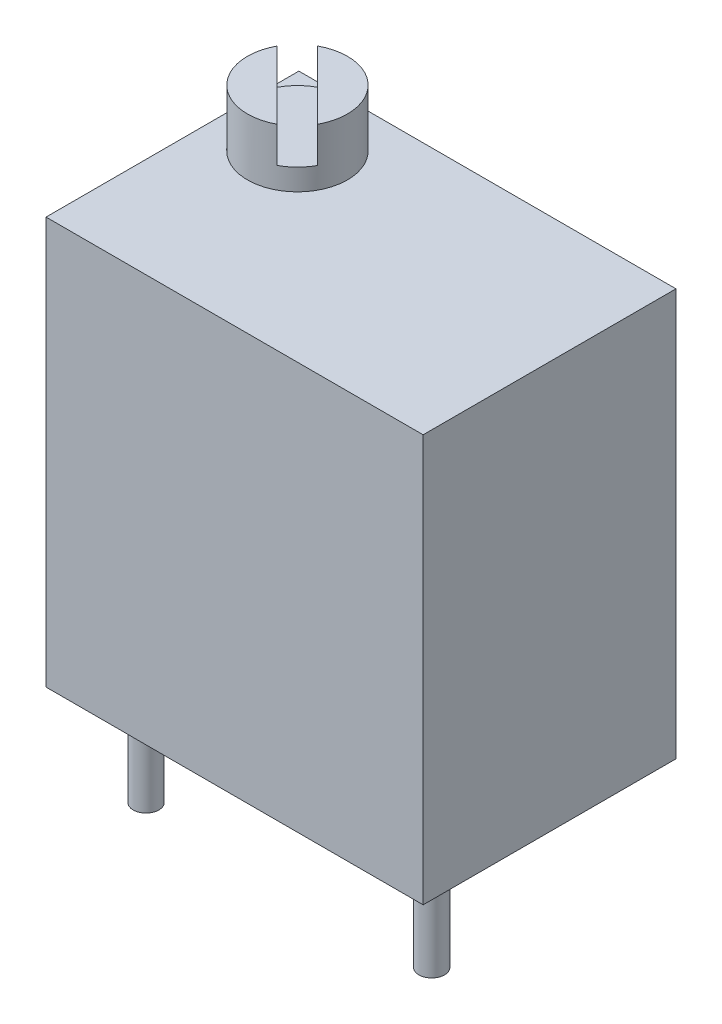
ISO-10303-21;
HEADER;
FILE_DESCRIPTION(('STEP AP214'),'2;1');
FILE_NAME('part.step','',(''),(''),'','','');
FILE_SCHEMA(('AUTOMOTIVE_DESIGN { 1 0 10303 214 1 1 1 1 }'));
ENDSEC;
DATA;
#1=APPLICATION_CONTEXT('core data for automotive mechanical design processes');
#2=APPLICATION_PROTOCOL_DEFINITION('international standard','automotive_design',2000,#1);
#3=PRODUCT_CONTEXT('',#1,'mechanical');
#4=PRODUCT('Part','Part','',(#3));
#5=PRODUCT_RELATED_PRODUCT_CATEGORY('part','',(#4));
#6=PRODUCT_DEFINITION_FORMATION('','',#4);
#7=PRODUCT_DEFINITION_CONTEXT('part definition',#1,'design');
#8=PRODUCT_DEFINITION('design','',#6,#7);
#9=PRODUCT_DEFINITION_SHAPE('','',#8);
#10=(LENGTH_UNIT() NAMED_UNIT(*) SI_UNIT(.MILLI.,.METRE.));
#11=(NAMED_UNIT(*) PLANE_ANGLE_UNIT() SI_UNIT($,.RADIAN.));
#12=(NAMED_UNIT(*) SI_UNIT($,.STERADIAN.) SOLID_ANGLE_UNIT());
#13=UNCERTAINTY_MEASURE_WITH_UNIT(LENGTH_MEASURE(1.E-05),#10,'distance_accuracy_value','');
#14=(GEOMETRIC_REPRESENTATION_CONTEXT(3) GLOBAL_UNCERTAINTY_ASSIGNED_CONTEXT((#13)) GLOBAL_UNIT_ASSIGNED_CONTEXT((#10,
#11,#12)) REPRESENTATION_CONTEXT('',''));
#15=CARTESIAN_POINT('',(0.,0.,0.));
#16=DIRECTION('',(0.,0.,1.));
#17=DIRECTION('',(1.,0.,0.));
#18=AXIS2_PLACEMENT_3D('',#15,#16,#17);
#19=CARTESIAN_POINT('',(-0.762,0.,-3.4798));
#20=DIRECTION('',(0.,-1.,0.));
#21=DIRECTION('',(0.,0.,-1.));
#22=AXIS2_PLACEMENT_3D('',#19,#20,#21);
#23=PLANE('',#22);
#24=CARTESIAN_POINT('',(5.08,0.,0.));
#25=DIRECTION('',(0.,-1.,0.));
#26=DIRECTION('',(0.,0.,-1.));
#27=AXIS2_PLACEMENT_3D('',#24,#25,#26);
#28=CIRCLE('',#27,0.2286);
#29=CARTESIAN_POINT('',(5.08,0.,-0.2286));
#30=VERTEX_POINT('',#29);
#31=EDGE_CURVE('E170',#30,#30,#28,.T.);
#32=ORIENTED_EDGE('',*,*,#31,.F.);
#33=EDGE_LOOP('',(#32));
#34=FACE_BOUND('',#33,.T.);
#35=DIRECTION('',(0.,0.,1.));
#36=VECTOR('',#35,1.);
#37=CARTESIAN_POINT('',(-0.762,0.,1.016));
#38=LINE('',#37,#36);
#39=CARTESIAN_POINT('',(-0.762,0.,-3.4798));
#40=VERTEX_POINT('',#39);
#41=CARTESIAN_POINT('',(-0.762,0.,1.016));
#42=VERTEX_POINT('',#41);
#43=EDGE_CURVE('E130',#40,#42,#38,.T.);
#44=ORIENTED_EDGE('',*,*,#43,.F.);
#45=DIRECTION('',(-1.,0.,0.));
#46=VECTOR('',#45,1.);
#47=CARTESIAN_POINT('',(-0.762,0.,-3.4798));
#48=LINE('',#47,#46);
#49=CARTESIAN_POINT('',(5.9436,0.,-3.4798));
#50=VERTEX_POINT('',#49);
#51=EDGE_CURVE('E78',#50,#40,#48,.T.);
#52=ORIENTED_EDGE('',*,*,#51,.F.);
#53=DIRECTION('',(0.,0.,-1.));
#54=VECTOR('',#53,1.);
#55=CARTESIAN_POINT('',(5.9436,0.,1.016));
#56=LINE('',#55,#54);
#57=CARTESIAN_POINT('',(5.9436,0.,1.016));
#58=VERTEX_POINT('',#57);
#59=EDGE_CURVE('E146',#58,#50,#56,.T.);
#60=ORIENTED_EDGE('',*,*,#59,.F.);
#61=DIRECTION('',(1.,0.,0.));
#62=VECTOR('',#61,1.);
#63=CARTESIAN_POINT('',(-0.762,0.,1.016));
#64=LINE('',#63,#62);
#65=EDGE_CURVE('E144',#42,#58,#64,.T.);
#66=ORIENTED_EDGE('',*,*,#65,.F.);
#67=EDGE_LOOP('',(#44,#52,#60,#66));
#68=FACE_BOUND('',#67,.T.);
#69=CARTESIAN_POINT('',(0.,0.,0.));
#70=DIRECTION('',(0.,-1.,0.));
#71=DIRECTION('',(0.,0.,-1.));
#72=AXIS2_PLACEMENT_3D('',#69,#70,#71);
#73=CIRCLE('',#72,0.2286);
#74=CARTESIAN_POINT('',(0.,0.,-0.2286));
#75=VERTEX_POINT('',#74);
#76=EDGE_CURVE('E166',#75,#75,#73,.T.);
#77=ORIENTED_EDGE('',*,*,#76,.F.);
#78=EDGE_LOOP('',(#77));
#79=FACE_BOUND('',#78,.T.);
#80=CARTESIAN_POINT('',(2.54,0.,-2.54));
#81=DIRECTION('',(0.,-1.,0.));
#82=DIRECTION('',(0.,0.,-1.));
#83=AXIS2_PLACEMENT_3D('',#80,#81,#82);
#84=CIRCLE('',#83,0.2286);
#85=CARTESIAN_POINT('',(2.54,0.,-2.7686));
#86=VERTEX_POINT('',#85);
#87=EDGE_CURVE('E176',#86,#86,#84,.T.);
#88=ORIENTED_EDGE('',*,*,#87,.F.);
#89=EDGE_LOOP('',(#88));
#90=FACE_BOUND('',#89,.T.);
#91=ADVANCED_FACE('F32',(#34,#68,#79,#90),#23,.T.);
#92=CARTESIAN_POINT('',(0.4572,8.255,-2.2352));
#93=DIRECTION('',(0.,1.,0.));
#94=DIRECTION('',(0.,0.,1.));
#95=AXIS2_PLACEMENT_3D('',#92,#93,#94);
#96=PLANE('',#95);
#97=DIRECTION('',(-0.707106781186549,0.,-0.707106781186546));
#98=VECTOR('',#97,1.);
#99=CARTESIAN_POINT('',(0.636805122421383,8.255,-2.41480512242138));
#100=LINE('',#99,#98);
#101=CARTESIAN_POINT('',(1.23921901668346,8.255,-1.81239122815931));
#102=VERTEX_POINT('',#101);
#103=CARTESIAN_POINT('',(0.0343912281593057,8.255,-3.01721901668346));
#104=VERTEX_POINT('',#103);
#105=EDGE_CURVE('E114',#102,#104,#100,.T.);
#106=ORIENTED_EDGE('',*,*,#105,.F.);
#107=CARTESIAN_POINT('',(0.4572,8.255,-2.2352));
#108=DIRECTION('',(0.,1.,0.));
#109=DIRECTION('',(0.,0.,1.));
#110=AXIS2_PLACEMENT_3D('',#107,#108,#109);
#111=CIRCLE('',#110,0.889);
#112=EDGE_CURVE('E126',#102,#104,#111,.T.);
#113=ORIENTED_EDGE('',*,*,#112,.T.);
#114=EDGE_LOOP('',(#106,#113));
#115=FACE_BOUND('',#114,.T.);
#116=ADVANCED_FACE('F207',(#115),#96,.T.);
#117=CARTESIAN_POINT('',(-0.762,7.239,-3.4798));
#118=DIRECTION('',(0.,-1.,0.));
#119=DIRECTION('',(0.,0.,-1.));
#120=AXIS2_PLACEMENT_3D('',#117,#118,#119);
#121=PLANE('',#120);
#122=DIRECTION('',(0.,0.,1.));
#123=VECTOR('',#122,1.);
#124=CARTESIAN_POINT('',(-0.762,7.239,1.016));
#125=LINE('',#124,#123);
#126=CARTESIAN_POINT('',(-0.762,7.239,-3.4798));
#127=VERTEX_POINT('',#126);
#128=CARTESIAN_POINT('',(-0.762,7.239,1.016));
#129=VERTEX_POINT('',#128);
#130=EDGE_CURVE('E135',#127,#129,#125,.T.);
#131=ORIENTED_EDGE('',*,*,#130,.T.);
#132=DIRECTION('',(1.,0.,0.));
#133=VECTOR('',#132,1.);
#134=CARTESIAN_POINT('',(-0.762,7.239,1.016));
#135=LINE('',#134,#133);
#136=CARTESIAN_POINT('',(5.9436,7.239,1.016));
#137=VERTEX_POINT('',#136);
#138=EDGE_CURVE('E86',#129,#137,#135,.T.);
#139=ORIENTED_EDGE('',*,*,#138,.T.);
#140=DIRECTION('',(0.,0.,-1.));
#141=VECTOR('',#140,1.);
#142=CARTESIAN_POINT('',(5.9436,7.239,1.016));
#143=LINE('',#142,#141);
#144=CARTESIAN_POINT('',(5.9436,7.239,-3.4798));
#145=VERTEX_POINT('',#144);
#146=EDGE_CURVE('E138',#137,#145,#143,.T.);
#147=ORIENTED_EDGE('',*,*,#146,.T.);
#148=DIRECTION('',(-1.,0.,0.));
#149=VECTOR('',#148,1.);
#150=CARTESIAN_POINT('',(-0.762,7.239,-3.4798));
#151=LINE('',#150,#149);
#152=EDGE_CURVE('E57',#145,#127,#151,.T.);
#153=ORIENTED_EDGE('',*,*,#152,.T.);
#154=EDGE_LOOP('',(#131,#139,#147,#153));
#155=FACE_BOUND('',#154,.T.);
#156=CARTESIAN_POINT('',(0.4572,7.239,-2.2352));
#157=DIRECTION('',(0.,-1.,0.));
#158=DIRECTION('',(0.,0.,-1.));
#159=AXIS2_PLACEMENT_3D('',#156,#157,#158);
#160=CIRCLE('',#159,0.889);
#161=CARTESIAN_POINT('',(0.4572,7.239,-3.1242));
#162=VERTEX_POINT('',#161);
#163=EDGE_CURVE('E115',#162,#162,#160,.F.);
#164=ORIENTED_EDGE('',*,*,#163,.F.);
#165=EDGE_LOOP('',(#164));
#166=FACE_BOUND('',#165,.T.);
#167=ADVANCED_FACE('F213',(#155,#166),#121,.F.);
#168=CARTESIAN_POINT('',(-0.762,7.239,1.016));
#169=DIRECTION('',(1.,0.,0.));
#170=DIRECTION('',(0.,0.,-1.));
#171=AXIS2_PLACEMENT_3D('',#168,#169,#170);
#172=PLANE('',#171);
#173=ORIENTED_EDGE('',*,*,#43,.T.);
#174=DIRECTION('',(0.,-1.,0.));
#175=VECTOR('',#174,1.);
#176=CARTESIAN_POINT('',(-0.762,7.239,1.016));
#177=LINE('',#176,#175);
#178=EDGE_CURVE('E155',#129,#42,#177,.T.);
#179=ORIENTED_EDGE('',*,*,#178,.F.);
#180=ORIENTED_EDGE('',*,*,#130,.F.);
#181=DIRECTION('',(0.,-1.,0.));
#182=VECTOR('',#181,1.);
#183=CARTESIAN_POINT('',(-0.762,7.239,-3.4798));
#184=LINE('',#183,#182);
#185=EDGE_CURVE('E141',#127,#40,#184,.T.);
#186=ORIENTED_EDGE('',*,*,#185,.T.);
#187=EDGE_LOOP('',(#173,#179,#180,#186));
#188=FACE_BOUND('',#187,.T.);
#189=ADVANCED_FACE('F34',(#188),#172,.F.);
#190=CARTESIAN_POINT('',(-0.762,7.239,1.016));
#191=DIRECTION('',(0.,0.,-1.));
#192=DIRECTION('',(-1.,0.,0.));
#193=AXIS2_PLACEMENT_3D('',#190,#191,#192);
#194=PLANE('',#193);
#195=ORIENTED_EDGE('',*,*,#65,.T.);
#196=DIRECTION('',(0.,-1.,0.));
#197=VECTOR('',#196,1.);
#198=CARTESIAN_POINT('',(5.9436,7.239,1.016));
#199=LINE('',#198,#197);
#200=EDGE_CURVE('E152',#137,#58,#199,.T.);
#201=ORIENTED_EDGE('',*,*,#200,.F.);
#202=ORIENTED_EDGE('',*,*,#138,.F.);
#203=ORIENTED_EDGE('',*,*,#178,.T.);
#204=EDGE_LOOP('',(#195,#201,#202,#203));
#205=FACE_BOUND('',#204,.T.);
#206=ADVANCED_FACE('F226',(#205),#194,.F.);
#207=CARTESIAN_POINT('',(5.9436,7.239,1.016));
#208=DIRECTION('',(-1.,0.,0.));
#209=DIRECTION('',(0.,0.,1.));
#210=AXIS2_PLACEMENT_3D('',#207,#208,#209);
#211=PLANE('',#210);
#212=ORIENTED_EDGE('',*,*,#59,.T.);
#213=DIRECTION('',(0.,-1.,0.));
#214=VECTOR('',#213,1.);
#215=CARTESIAN_POINT('',(5.9436,7.239,-3.4798));
#216=LINE('',#215,#214);
#217=EDGE_CURVE('E150',#145,#50,#216,.T.);
#218=ORIENTED_EDGE('',*,*,#217,.F.);
#219=ORIENTED_EDGE('',*,*,#146,.F.);
#220=ORIENTED_EDGE('',*,*,#200,.T.);
#221=EDGE_LOOP('',(#212,#218,#219,#220));
#222=FACE_BOUND('',#221,.T.);
#223=ADVANCED_FACE('F224',(#222),#211,.F.);
#224=CARTESIAN_POINT('',(-0.762,7.239,-3.4798));
#225=DIRECTION('',(0.,0.,1.));
#226=DIRECTION('',(1.,0.,0.));
#227=AXIS2_PLACEMENT_3D('',#224,#225,#226);
#228=PLANE('',#227);
#229=ORIENTED_EDGE('',*,*,#51,.T.);
#230=ORIENTED_EDGE('',*,*,#185,.F.);
#231=ORIENTED_EDGE('',*,*,#152,.F.);
#232=ORIENTED_EDGE('',*,*,#217,.T.);
#233=EDGE_LOOP('',(#229,#230,#231,#232));
#234=FACE_BOUND('',#233,.T.);
#235=ADVANCED_FACE('F221',(#234),#228,.F.);
#236=CARTESIAN_POINT('',(0.4572,8.255,-2.2352));
#237=DIRECTION('',(0.,-1.,0.));
#238=DIRECTION('',(0.,0.,-1.));
#239=AXIS2_PLACEMENT_3D('',#236,#237,#238);
#240=CYLINDRICAL_SURFACE('',#239,0.889);
#241=ORIENTED_EDGE('',*,*,#112,.F.);
#242=DIRECTION('',(0.,-1.,0.));
#243=VECTOR('',#242,1.);
#244=CARTESIAN_POINT('',(1.23921901668346,8.255,-1.81239122815931));
#245=LINE('',#244,#243);
#246=CARTESIAN_POINT('',(1.23921901668346,7.62,-1.81239122815931));
#247=VERTEX_POINT('',#246);
#248=EDGE_CURVE('E127',#102,#247,#245,.T.);
#249=ORIENTED_EDGE('',*,*,#248,.T.);
#250=CARTESIAN_POINT('',(0.4572,7.62,-2.2352));
#251=DIRECTION('',(0.,-1.,0.));
#252=DIRECTION('',(0.,0.,-1.));
#253=AXIS2_PLACEMENT_3D('',#250,#251,#252);
#254=CIRCLE('',#253,0.889);
#255=CARTESIAN_POINT('',(0.880008771840695,7.62,-1.45318098331654));
#256=VERTEX_POINT('',#255);
#257=EDGE_CURVE('E11',#247,#256,#254,.T.);
#258=ORIENTED_EDGE('',*,*,#257,.T.);
#259=DIRECTION('',(0.,-1.,0.));
#260=VECTOR('',#259,1.);
#261=CARTESIAN_POINT('',(0.880008771840695,8.255,-1.45318098331654));
#262=LINE('',#261,#260);
#263=CARTESIAN_POINT('',(0.880008771840695,8.255,-1.45318098331654));
#264=VERTEX_POINT('',#263);
#265=EDGE_CURVE('E109',#256,#264,#262,.F.);
#266=ORIENTED_EDGE('',*,*,#265,.T.);
#267=CARTESIAN_POINT('',(-0.32481901668346,8.255,-2.65800877184069));
#268=VERTEX_POINT('',#267);
#269=EDGE_CURVE('E121',#268,#264,#111,.T.);
#270=ORIENTED_EDGE('',*,*,#269,.F.);
#271=DIRECTION('',(0.,-1.,0.));
#272=VECTOR('',#271,1.);
#273=CARTESIAN_POINT('',(-0.32481901668346,8.255,-2.65800877184069));
#274=LINE('',#273,#272);
#275=CARTESIAN_POINT('',(-0.32481901668346,7.62,-2.65800877184069));
#276=VERTEX_POINT('',#275);
#277=EDGE_CURVE('E48',#268,#276,#274,.T.);
#278=ORIENTED_EDGE('',*,*,#277,.T.);
#279=CARTESIAN_POINT('',(0.0343912281593057,7.62,-3.01721901668346));
#280=VERTEX_POINT('',#279);
#281=EDGE_CURVE('E41',#276,#280,#254,.T.);
#282=ORIENTED_EDGE('',*,*,#281,.T.);
#283=DIRECTION('',(0.,-1.,0.));
#284=VECTOR('',#283,1.);
#285=CARTESIAN_POINT('',(0.0343912281593056,8.255,-3.01721901668346));
#286=LINE('',#285,#284);
#287=EDGE_CURVE('E131',#280,#104,#286,.F.);
#288=ORIENTED_EDGE('',*,*,#287,.T.);
#289=EDGE_LOOP('',(#241,#249,#258,#266,#270,#278,#282,#288));
#290=FACE_BOUND('',#289,.T.);
#291=ORIENTED_EDGE('',*,*,#163,.T.);
#292=EDGE_LOOP('',(#291));
#293=FACE_BOUND('',#292,.T.);
#294=ADVANCED_FACE('F119',(#290,#293),#240,.T.);
#295=DIRECTION('',(0.707106781186549,0.,0.707106781186546));
#296=VECTOR('',#295,1.);
#297=CARTESIAN_POINT('',(0.277594877578617,8.255,-2.05559487757862));
#298=LINE('',#297,#296);
#299=EDGE_CURVE('E106',#268,#264,#298,.T.);
#300=ORIENTED_EDGE('',*,*,#299,.F.);
#301=ORIENTED_EDGE('',*,*,#269,.T.);
#302=EDGE_LOOP('',(#300,#301));
#303=FACE_BOUND('',#302,.T.);
#304=ADVANCED_FACE('F125',(#303),#96,.T.);
#305=CARTESIAN_POINT('',(-0.0909261259106569,7.62,-3.14253637075342));
#306=DIRECTION('',(0.,-1.,0.));
#307=DIRECTION('',(0.,0.,-1.));
#308=AXIS2_PLACEMENT_3D('',#305,#306,#307);
#309=PLANE('',#308);
#310=DIRECTION('',(-0.707106781186549,0.,-0.707106781186546));
#311=VECTOR('',#310,1.);
#312=CARTESIAN_POINT('',(-0.090926125910657,7.62,-3.14253637075342));
#313=LINE('',#312,#311);
#314=EDGE_CURVE('E123',#247,#280,#313,.T.);
#315=ORIENTED_EDGE('',*,*,#314,.T.);
#316=ORIENTED_EDGE('',*,*,#281,.F.);
#317=DIRECTION('',(0.707106781186549,0.,0.707106781186546));
#318=VECTOR('',#317,1.);
#319=CARTESIAN_POINT('',(-0.450136370753422,7.62,-2.78332612591065));
#320=LINE('',#319,#318);
#321=EDGE_CURVE('E164',#276,#256,#320,.T.);
#322=ORIENTED_EDGE('',*,*,#321,.T.);
#323=ORIENTED_EDGE('',*,*,#257,.F.);
#324=EDGE_LOOP('',(#315,#316,#322,#323));
#325=FACE_BOUND('',#324,.T.);
#326=ADVANCED_FACE('F163',(#325),#309,.F.);
#327=CARTESIAN_POINT('',(-0.090926125910657,7.62,-3.14253637075342));
#328=DIRECTION('',(0.707106781186546,0.,-0.707106781186549));
#329=DIRECTION('',(-0.707106781186549,0.,-0.707106781186546));
#330=AXIS2_PLACEMENT_3D('',#327,#328,#329);
#331=PLANE('',#330);
#332=ORIENTED_EDGE('',*,*,#105,.T.);
#333=ORIENTED_EDGE('',*,*,#287,.F.);
#334=ORIENTED_EDGE('',*,*,#314,.F.);
#335=ORIENTED_EDGE('',*,*,#248,.F.);
#336=EDGE_LOOP('',(#332,#333,#334,#335));
#337=FACE_BOUND('',#336,.T.);
#338=ADVANCED_FACE('F251',(#337),#331,.F.);
#339=CARTESIAN_POINT('',(-0.450136370753422,7.62,-2.78332612591065));
#340=DIRECTION('',(-0.707106781186546,0.,0.707106781186549));
#341=DIRECTION('',(0.707106781186549,0.,0.707106781186546));
#342=AXIS2_PLACEMENT_3D('',#339,#340,#341);
#343=PLANE('',#342);
#344=ORIENTED_EDGE('',*,*,#299,.T.);
#345=ORIENTED_EDGE('',*,*,#265,.F.);
#346=ORIENTED_EDGE('',*,*,#321,.F.);
#347=ORIENTED_EDGE('',*,*,#277,.F.);
#348=EDGE_LOOP('',(#344,#345,#346,#347));
#349=FACE_BOUND('',#348,.T.);
#350=ADVANCED_FACE('F108',(#349),#343,.F.);
#351=CARTESIAN_POINT('',(0.,-4.7752,0.));
#352=DIRECTION('',(0.,1.,0.));
#353=DIRECTION('',(0.,0.,1.));
#354=AXIS2_PLACEMENT_3D('',#351,#352,#353);
#355=CYLINDRICAL_SURFACE('',#354,0.2286);
#356=CARTESIAN_POINT('',(0.,-1.905,0.));
#357=DIRECTION('',(0.,1.,0.));
#358=DIRECTION('',(-1.,0.,0.));
#359=AXIS2_PLACEMENT_3D('',#356,#357,#358);
#360=CIRCLE('',#359,0.2286);
#361=CARTESIAN_POINT('',(-0.2286,-1.905,0.));
#362=VERTEX_POINT('',#361);
#363=EDGE_CURVE('E179',#362,#362,#360,.T.);
#364=ORIENTED_EDGE('',*,*,#363,.T.);
#365=EDGE_LOOP('',(#364));
#366=FACE_BOUND('',#365,.T.);
#367=ORIENTED_EDGE('',*,*,#76,.T.);
#368=EDGE_LOOP('',(#367));
#369=FACE_BOUND('',#368,.T.);
#370=ADVANCED_FACE('F250',(#366,#369),#355,.T.);
#371=CARTESIAN_POINT('',(5.08,-4.7752,0.));
#372=DIRECTION('',(0.,1.,0.));
#373=DIRECTION('',(0.,0.,1.));
#374=AXIS2_PLACEMENT_3D('',#371,#372,#373);
#375=CYLINDRICAL_SURFACE('',#374,0.2286);
#376=CARTESIAN_POINT('',(5.08,-1.905,0.));
#377=DIRECTION('',(0.,1.,0.));
#378=DIRECTION('',(-1.,0.,0.));
#379=AXIS2_PLACEMENT_3D('',#376,#377,#378);
#380=CIRCLE('',#379,0.2286);
#381=CARTESIAN_POINT('',(4.8514,-1.905,0.));
#382=VERTEX_POINT('',#381);
#383=EDGE_CURVE('E182',#382,#382,#380,.T.);
#384=ORIENTED_EDGE('',*,*,#383,.T.);
#385=EDGE_LOOP('',(#384));
#386=FACE_BOUND('',#385,.T.);
#387=ORIENTED_EDGE('',*,*,#31,.T.);
#388=EDGE_LOOP('',(#387));
#389=FACE_BOUND('',#388,.T.);
#390=ADVANCED_FACE('F202',(#386,#389),#375,.T.);
#391=CARTESIAN_POINT('',(2.54,-4.7752,-2.54));
#392=DIRECTION('',(0.,1.,0.));
#393=DIRECTION('',(0.,0.,1.));
#394=AXIS2_PLACEMENT_3D('',#391,#392,#393);
#395=CYLINDRICAL_SURFACE('',#394,0.2286);
#396=CARTESIAN_POINT('',(2.54,-1.905,-2.54));
#397=DIRECTION('',(0.,1.,0.));
#398=DIRECTION('',(-1.,0.,0.));
#399=AXIS2_PLACEMENT_3D('',#396,#397,#398);
#400=CIRCLE('',#399,0.2286);
#401=CARTESIAN_POINT('',(2.3114,-1.905,-2.54));
#402=VERTEX_POINT('',#401);
#403=EDGE_CURVE('E36',#402,#402,#400,.T.);
#404=ORIENTED_EDGE('',*,*,#403,.T.);
#405=EDGE_LOOP('',(#404));
#406=FACE_BOUND('',#405,.T.);
#407=ORIENTED_EDGE('',*,*,#87,.T.);
#408=EDGE_LOOP('',(#407));
#409=FACE_BOUND('',#408,.T.);
#410=ADVANCED_FACE('F189',(#406,#409),#395,.T.);
#411=CARTESIAN_POINT('',(-0.2286,-1.905,-3.4798));
#412=DIRECTION('',(0.,1.,0.));
#413=DIRECTION('',(-1.,0.,0.));
#414=AXIS2_PLACEMENT_3D('',#411,#412,#413);
#415=PLANE('',#414);
#416=ORIENTED_EDGE('',*,*,#403,.F.);
#417=EDGE_LOOP('',(#416));
#418=FACE_BOUND('',#417,.T.);
#419=ADVANCED_FACE('F192',(#418),#415,.F.);
#420=ORIENTED_EDGE('',*,*,#383,.F.);
#421=EDGE_LOOP('',(#420));
#422=FACE_BOUND('',#421,.T.);
#423=ADVANCED_FACE('F194',(#422),#415,.F.);
#424=ORIENTED_EDGE('',*,*,#363,.F.);
#425=EDGE_LOOP('',(#424));
#426=FACE_BOUND('',#425,.T.);
#427=ADVANCED_FACE('F196',(#426),#415,.F.);
#428=CLOSED_SHELL('',(#91,#116,#167,#189,#206,#223,#235,#294,#304,#326,#338,#350,#370,#390,#410,
#419,#423,#427));
#429=MANIFOLD_SOLID_BREP('B2',#428);
#430=ADVANCED_BREP_SHAPE_REPRESENTATION('',(#18,#429),#14);
#431=SHAPE_DEFINITION_REPRESENTATION(#9,#430);
ENDSEC;
END-ISO-10303-21;
